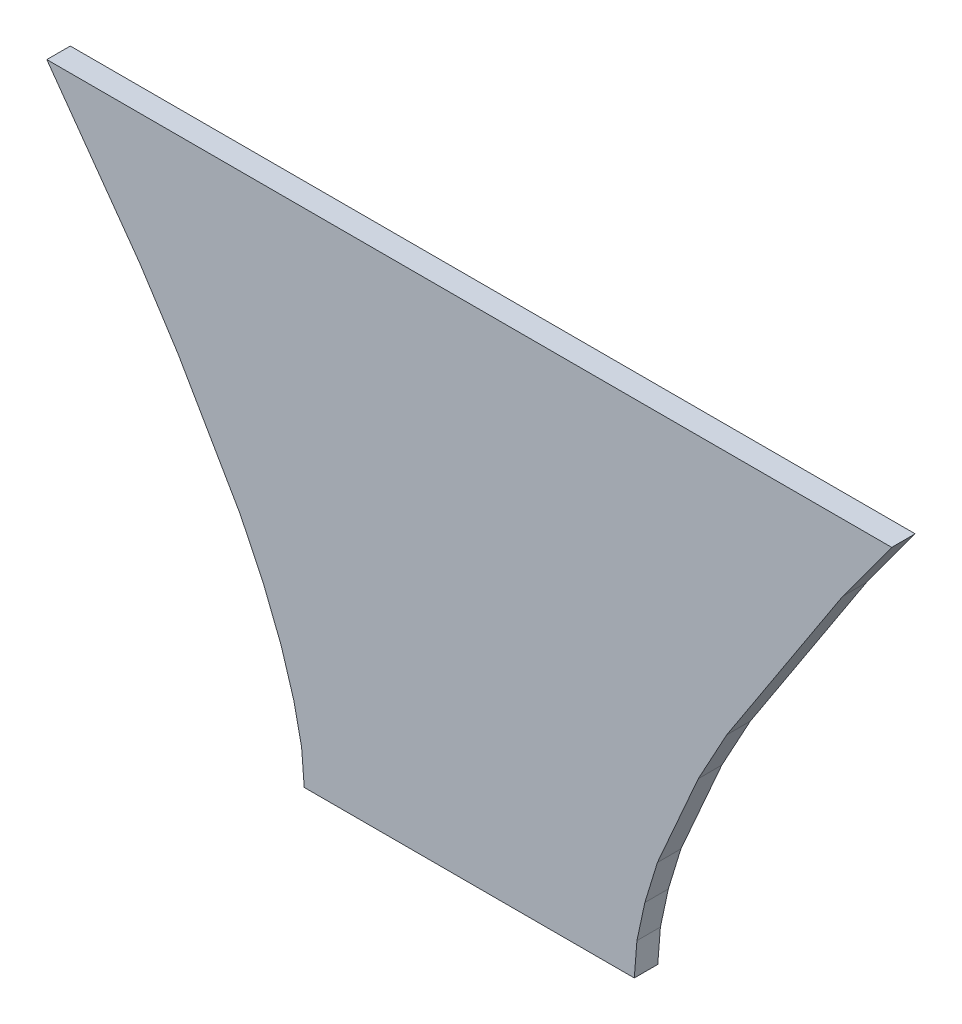
ISO-10303-21;
HEADER;
FILE_DESCRIPTION(('STEP AP214'),'2;1');
FILE_NAME('part.step','',(''),(''),'','','');
FILE_SCHEMA(('AUTOMOTIVE_DESIGN { 1 0 10303 214 1 1 1 1 }'));
ENDSEC;
DATA;
#1=APPLICATION_CONTEXT('core data for automotive mechanical design processes');
#2=APPLICATION_PROTOCOL_DEFINITION('international standard','automotive_design',2000,#1);
#3=PRODUCT_CONTEXT('',#1,'mechanical');
#4=PRODUCT('Part','Part','',(#3));
#5=PRODUCT_RELATED_PRODUCT_CATEGORY('part','',(#4));
#6=PRODUCT_DEFINITION_FORMATION('','',#4);
#7=PRODUCT_DEFINITION_CONTEXT('part definition',#1,'design');
#8=PRODUCT_DEFINITION('design','',#6,#7);
#9=PRODUCT_DEFINITION_SHAPE('','',#8);
#10=(LENGTH_UNIT() NAMED_UNIT(*) SI_UNIT(.MILLI.,.METRE.));
#11=(NAMED_UNIT(*) PLANE_ANGLE_UNIT() SI_UNIT($,.RADIAN.));
#12=(NAMED_UNIT(*) SI_UNIT($,.STERADIAN.) SOLID_ANGLE_UNIT());
#13=UNCERTAINTY_MEASURE_WITH_UNIT(LENGTH_MEASURE(1.E-05),#10,'distance_accuracy_value','');
#14=(GEOMETRIC_REPRESENTATION_CONTEXT(3) GLOBAL_UNCERTAINTY_ASSIGNED_CONTEXT((#13)) GLOBAL_UNIT_ASSIGNED_CONTEXT((#10,
#11,#12)) REPRESENTATION_CONTEXT('',''));
#15=CARTESIAN_POINT('',(0.,0.,0.));
#16=DIRECTION('',(0.,0.,1.));
#17=DIRECTION('',(1.,0.,0.));
#18=AXIS2_PLACEMENT_3D('',#15,#16,#17);
#19=CARTESIAN_POINT('',(115.089996337891,103.059997558594,0.));
#20=DIRECTION('',(-0.996930394738995,0.0782929629376174,0.));
#21=DIRECTION('',(0.0782929629376174,0.996930394738995,0.));
#22=AXIS2_PLACEMENT_3D('',#19,#20,#21);
#23=PLANE('',#22);
#24=DIRECTION('',(0.0782929629376174,0.996930394738995,0.));
#25=VECTOR('',#24,1.);
#26=CARTESIAN_POINT('',(115.089996337891,103.059997558594,0.03556));
#27=LINE('',#26,#25);
#28=CARTESIAN_POINT('',(115.089996337891,103.059997558594,0.03556));
#29=VERTEX_POINT('',#28);
#30=CARTESIAN_POINT('',(115.09400177002,103.111000061035,0.03556));
#31=VERTEX_POINT('',#30);
#32=EDGE_CURVE('E11',#29,#31,#27,.T.);
#33=ORIENTED_EDGE('',*,*,#32,.F.);
#34=DIRECTION('',(0.,0.,1.));
#35=VECTOR('',#34,1.);
#36=CARTESIAN_POINT('',(115.089996337891,103.059997558594,0.));
#37=LINE('',#36,#35);
#38=CARTESIAN_POINT('',(115.089996337891,103.059997558594,0.));
#39=VERTEX_POINT('',#38);
#40=EDGE_CURVE('E24',#39,#29,#37,.T.);
#41=ORIENTED_EDGE('',*,*,#40,.F.);
#42=DIRECTION('',(0.0782929629376174,0.996930394738995,0.));
#43=VECTOR('',#42,1.);
#44=CARTESIAN_POINT('',(115.089996337891,103.059997558594,0.));
#45=LINE('',#44,#43);
#46=CARTESIAN_POINT('',(115.09400177002,103.111000061035,0.));
#47=VERTEX_POINT('',#46);
#48=EDGE_CURVE('E154',#39,#47,#45,.T.);
#49=ORIENTED_EDGE('',*,*,#48,.T.);
#50=DIRECTION('',(0.,0.,1.));
#51=VECTOR('',#50,1.);
#52=CARTESIAN_POINT('',(115.09400177002,103.111000061035,0.));
#53=LINE('',#52,#51);
#54=EDGE_CURVE('E37',#47,#31,#53,.T.);
#55=ORIENTED_EDGE('',*,*,#54,.T.);
#56=EDGE_LOOP('',(#33,#41,#49,#55));
#57=FACE_BOUND('',#56,.T.);
#58=ADVANCED_FACE('F17',(#57),#23,.F.);
#59=CARTESIAN_POINT('',(115.09400177002,103.111000061035,0.));
#60=DIRECTION('',(-0.977798514930854,0.20954728392183,0.));
#61=DIRECTION('',(0.20954728392183,0.977798514930854,0.));
#62=AXIS2_PLACEMENT_3D('',#59,#60,#61);
#63=PLANE('',#62);
#64=DIRECTION('',(0.20954728392183,0.977798514930854,0.));
#65=VECTOR('',#64,1.);
#66=CARTESIAN_POINT('',(115.09400177002,103.111000061035,0.03556));
#67=LINE('',#66,#65);
#68=CARTESIAN_POINT('',(115.106002807617,103.166999816895,0.03556));
#69=VERTEX_POINT('',#68);
#70=EDGE_CURVE('E266',#31,#69,#67,.T.);
#71=ORIENTED_EDGE('',*,*,#70,.F.);
#72=ORIENTED_EDGE('',*,*,#54,.F.);
#73=DIRECTION('',(0.20954728392183,0.977798514930854,0.));
#74=VECTOR('',#73,1.);
#75=CARTESIAN_POINT('',(115.09400177002,103.111000061035,0.));
#76=LINE('',#75,#74);
#77=CARTESIAN_POINT('',(115.106002807617,103.166999816895,0.));
#78=VERTEX_POINT('',#77);
#79=EDGE_CURVE('E263',#47,#78,#76,.T.);
#80=ORIENTED_EDGE('',*,*,#79,.T.);
#81=DIRECTION('',(0.,0.,1.));
#82=VECTOR('',#81,1.);
#83=CARTESIAN_POINT('',(115.106002807617,103.166999816895,0.));
#84=LINE('',#83,#82);
#85=EDGE_CURVE('E261',#78,#69,#84,.T.);
#86=ORIENTED_EDGE('',*,*,#85,.T.);
#87=EDGE_LOOP('',(#71,#72,#80,#86));
#88=FACE_BOUND('',#87,.T.);
#89=ADVANCED_FACE('F274',(#88),#63,.F.);
#90=CARTESIAN_POINT('',(115.106002807617,103.166999816895,0.));
#91=DIRECTION('',(-0.956119267602671,0.292977722905569,0.));
#92=DIRECTION('',(0.292977722905569,0.956119267602671,0.));
#93=AXIS2_PLACEMENT_3D('',#90,#91,#92);
#94=PLANE('',#93);
#95=DIRECTION('',(0.292977722905569,0.956119267602671,0.));
#96=VECTOR('',#95,1.);
#97=CARTESIAN_POINT('',(115.106002807617,103.166999816895,0.03556));
#98=LINE('',#97,#96);
#99=CARTESIAN_POINT('',(115.125,103.228996276855,0.03556));
#100=VERTEX_POINT('',#99);
#101=EDGE_CURVE('E258',#69,#100,#98,.T.);
#102=ORIENTED_EDGE('',*,*,#101,.F.);
#103=ORIENTED_EDGE('',*,*,#85,.F.);
#104=DIRECTION('',(0.292977722905569,0.956119267602671,0.));
#105=VECTOR('',#104,1.);
#106=CARTESIAN_POINT('',(115.106002807617,103.166999816895,0.));
#107=LINE('',#106,#105);
#108=CARTESIAN_POINT('',(115.125,103.228996276855,0.));
#109=VERTEX_POINT('',#108);
#110=EDGE_CURVE('E255',#78,#109,#107,.T.);
#111=ORIENTED_EDGE('',*,*,#110,.T.);
#112=DIRECTION('',(0.,0.,1.));
#113=VECTOR('',#112,1.);
#114=CARTESIAN_POINT('',(115.125,103.228996276855,0.));
#115=LINE('',#114,#113);
#116=EDGE_CURVE('E253',#109,#100,#115,.T.);
#117=ORIENTED_EDGE('',*,*,#116,.T.);
#118=EDGE_LOOP('',(#102,#103,#111,#117));
#119=FACE_BOUND('',#118,.T.);
#120=ADVANCED_FACE('F280',(#119),#94,.F.);
#121=CARTESIAN_POINT('',(115.125,103.228996276855,0.));
#122=DIRECTION('',(-0.91542601011041,0.402486297919986,0.));
#123=DIRECTION('',(0.402486297919986,0.91542601011041,0.));
#124=AXIS2_PLACEMENT_3D('',#121,#122,#123);
#125=PLANE('',#124);
#126=DIRECTION('',(0.402486297919986,0.91542601011041,0.));
#127=VECTOR('',#126,1.);
#128=CARTESIAN_POINT('',(115.125,103.228996276855,0.03556));
#129=LINE('',#128,#127);
#130=CARTESIAN_POINT('',(115.186996459961,103.370002746582,0.03556));
#131=VERTEX_POINT('',#130);
#132=EDGE_CURVE('E250',#100,#131,#129,.T.);
#133=ORIENTED_EDGE('',*,*,#132,.F.);
#134=ORIENTED_EDGE('',*,*,#116,.F.);
#135=DIRECTION('',(0.402486297919986,0.91542601011041,0.));
#136=VECTOR('',#135,1.);
#137=CARTESIAN_POINT('',(115.125,103.228996276855,0.));
#138=LINE('',#137,#136);
#139=CARTESIAN_POINT('',(115.186996459961,103.370002746582,0.));
#140=VERTEX_POINT('',#139);
#141=EDGE_CURVE('E247',#109,#140,#138,.T.);
#142=ORIENTED_EDGE('',*,*,#141,.T.);
#143=DIRECTION('',(0.,0.,1.));
#144=VECTOR('',#143,1.);
#145=CARTESIAN_POINT('',(115.186996459961,103.370002746582,0.));
#146=LINE('',#145,#144);
#147=EDGE_CURVE('E245',#140,#131,#146,.T.);
#148=ORIENTED_EDGE('',*,*,#147,.T.);
#149=EDGE_LOOP('',(#133,#134,#142,#148));
#150=FACE_BOUND('',#149,.T.);
#151=ADVANCED_FACE('F282',(#150),#125,.F.);
#152=CARTESIAN_POINT('',(115.186996459961,103.370002746582,0.));
#153=DIRECTION('',(-0.878274577246839,0.478156634338462,0.));
#154=DIRECTION('',(0.478156634338462,0.878274577246839,0.));
#155=AXIS2_PLACEMENT_3D('',#152,#153,#154);
#156=PLANE('',#155);
#157=DIRECTION('',(0.478156634338462,0.878274577246839,0.));
#158=VECTOR('',#157,1.);
#159=CARTESIAN_POINT('',(115.186996459961,103.370002746582,0.03556));
#160=LINE('',#159,#158);
#161=CARTESIAN_POINT('',(115.230003356934,103.448997497559,0.03556));
#162=VERTEX_POINT('',#161);
#163=EDGE_CURVE('E242',#131,#162,#160,.T.);
#164=ORIENTED_EDGE('',*,*,#163,.F.);
#165=ORIENTED_EDGE('',*,*,#147,.F.);
#166=DIRECTION('',(0.478156634338462,0.878274577246839,0.));
#167=VECTOR('',#166,1.);
#168=CARTESIAN_POINT('',(115.186996459961,103.370002746582,0.));
#169=LINE('',#168,#167);
#170=CARTESIAN_POINT('',(115.230003356934,103.448997497559,0.));
#171=VERTEX_POINT('',#170);
#172=EDGE_CURVE('E239',#140,#171,#169,.T.);
#173=ORIENTED_EDGE('',*,*,#172,.T.);
#174=DIRECTION('',(0.,0.,1.));
#175=VECTOR('',#174,1.);
#176=CARTESIAN_POINT('',(115.230003356934,103.448997497559,0.));
#177=LINE('',#176,#175);
#178=EDGE_CURVE('E237',#171,#162,#177,.T.);
#179=ORIENTED_EDGE('',*,*,#178,.T.);
#180=EDGE_LOOP('',(#164,#165,#173,#179));
#181=FACE_BOUND('',#180,.T.);
#182=ADVANCED_FACE('F287',(#181),#156,.F.);
#183=CARTESIAN_POINT('',(115.230003356934,103.448997497559,0.));
#184=DIRECTION('',(-0.837745255800057,0.5460612478326,0.));
#185=DIRECTION('',(0.5460612478326,0.837745255800057,0.));
#186=AXIS2_PLACEMENT_3D('',#183,#184,#185);
#187=PLANE('',#186);
#188=DIRECTION('',(0.5460612478326,0.837745255800057,0.));
#189=VECTOR('',#188,1.);
#190=CARTESIAN_POINT('',(115.230003356934,103.448997497559,0.03556));
#191=LINE('',#190,#189);
#192=CARTESIAN_POINT('',(115.40599822998,103.71900177002,0.03556));
#193=VERTEX_POINT('',#192);
#194=EDGE_CURVE('E234',#162,#193,#191,.T.);
#195=ORIENTED_EDGE('',*,*,#194,.F.);
#196=ORIENTED_EDGE('',*,*,#178,.F.);
#197=DIRECTION('',(0.5460612478326,0.837745255800057,0.));
#198=VECTOR('',#197,1.);
#199=CARTESIAN_POINT('',(115.230003356934,103.448997497559,0.));
#200=LINE('',#199,#198);
#201=CARTESIAN_POINT('',(115.40599822998,103.71900177002,0.));
#202=VERTEX_POINT('',#201);
#203=EDGE_CURVE('E231',#171,#202,#200,.T.);
#204=ORIENTED_EDGE('',*,*,#203,.T.);
#205=DIRECTION('',(0.,0.,1.));
#206=VECTOR('',#205,1.);
#207=CARTESIAN_POINT('',(115.40599822998,103.71900177002,0.));
#208=LINE('',#207,#206);
#209=EDGE_CURVE('E229',#202,#193,#208,.T.);
#210=ORIENTED_EDGE('',*,*,#209,.T.);
#211=EDGE_LOOP('',(#195,#196,#204,#210));
#212=FACE_BOUND('',#211,.T.);
#213=ADVANCED_FACE('F290',(#212),#187,.F.);
#214=CARTESIAN_POINT('',(115.40599822998,103.71900177002,0.));
#215=DIRECTION('',(-0.806633523114171,0.591051909216458,0.));
#216=DIRECTION('',(0.591051909216458,0.806633523114171,0.));
#217=AXIS2_PLACEMENT_3D('',#214,#215,#216);
#218=PLANE('',#217);
#219=DIRECTION('',(0.591051909216458,0.806633523114171,0.));
#220=VECTOR('',#219,1.);
#221=CARTESIAN_POINT('',(115.40599822998,103.71900177002,0.03556));
#222=LINE('',#221,#220);
#223=CARTESIAN_POINT('',(115.480003356934,103.819999694824,0.03556));
#224=VERTEX_POINT('',#223);
#225=EDGE_CURVE('E226',#193,#224,#222,.T.);
#226=ORIENTED_EDGE('',*,*,#225,.F.);
#227=ORIENTED_EDGE('',*,*,#209,.F.);
#228=DIRECTION('',(0.591051909216458,0.806633523114171,0.));
#229=VECTOR('',#228,1.);
#230=CARTESIAN_POINT('',(115.40599822998,103.71900177002,0.));
#231=LINE('',#230,#229);
#232=CARTESIAN_POINT('',(115.480003356934,103.819999694824,0.));
#233=VERTEX_POINT('',#232);
#234=EDGE_CURVE('E223',#202,#233,#231,.T.);
#235=ORIENTED_EDGE('',*,*,#234,.T.);
#236=DIRECTION('',(0.,0.,1.));
#237=VECTOR('',#236,1.);
#238=CARTESIAN_POINT('',(115.480003356934,103.819999694824,0.));
#239=LINE('',#238,#237);
#240=EDGE_CURVE('E221',#233,#224,#239,.T.);
#241=ORIENTED_EDGE('',*,*,#240,.T.);
#242=EDGE_LOOP('',(#226,#227,#235,#241));
#243=FACE_BOUND('',#242,.T.);
#244=ADVANCED_FACE('F295',(#243),#218,.F.);
#245=CARTESIAN_POINT('',(115.480003356934,103.819999694824,0.));
#246=DIRECTION('',(0.,-1.,0.));
#247=DIRECTION('',(-1.,0.,0.));
#248=AXIS2_PLACEMENT_3D('',#245,#246,#247);
#249=PLANE('',#248);
#250=DIRECTION('',(-1.,0.,0.));
#251=VECTOR('',#250,1.);
#252=CARTESIAN_POINT('',(115.480003356934,103.819999694824,0.03556));
#253=LINE('',#252,#251);
#254=CARTESIAN_POINT('',(114.199996948242,103.819999694824,0.03556));
#255=VERTEX_POINT('',#254);
#256=EDGE_CURVE('E218',#224,#255,#253,.T.);
#257=ORIENTED_EDGE('',*,*,#256,.F.);
#258=ORIENTED_EDGE('',*,*,#240,.F.);
#259=DIRECTION('',(-1.,0.,0.));
#260=VECTOR('',#259,1.);
#261=CARTESIAN_POINT('',(115.480003356934,103.819999694824,0.));
#262=LINE('',#261,#260);
#263=CARTESIAN_POINT('',(114.199996948242,103.819999694824,0.));
#264=VERTEX_POINT('',#263);
#265=EDGE_CURVE('E215',#233,#264,#262,.T.);
#266=ORIENTED_EDGE('',*,*,#265,.T.);
#267=DIRECTION('',(0.,0.,1.));
#268=VECTOR('',#267,1.);
#269=CARTESIAN_POINT('',(114.199996948242,103.819999694824,0.));
#270=LINE('',#269,#268);
#271=EDGE_CURVE('E213',#264,#255,#270,.T.);
#272=ORIENTED_EDGE('',*,*,#271,.T.);
#273=EDGE_LOOP('',(#257,#258,#266,#272));
#274=FACE_BOUND('',#273,.T.);
#275=ADVANCED_FACE('F298',(#274),#249,.F.);
#276=CARTESIAN_POINT('',(114.199996948242,103.819999694824,0.));
#277=DIRECTION('',(0.813160684202326,0.582039261276767,0.));
#278=DIRECTION('',(0.582039261276767,-0.813160684202326,0.));
#279=AXIS2_PLACEMENT_3D('',#276,#277,#278);
#280=PLANE('',#279);
#281=DIRECTION('',(0.582039261276767,-0.813160684202326,0.));
#282=VECTOR('',#281,1.);
#283=CARTESIAN_POINT('',(114.199996948242,103.819999694824,0.03556));
#284=LINE('',#283,#282);
#285=CARTESIAN_POINT('',(114.341003417969,103.623001098633,0.03556));
#286=VERTEX_POINT('',#285);
#287=EDGE_CURVE('E210',#255,#286,#284,.T.);
#288=ORIENTED_EDGE('',*,*,#287,.F.);
#289=ORIENTED_EDGE('',*,*,#271,.F.);
#290=DIRECTION('',(0.582039261276767,-0.813160684202326,0.));
#291=VECTOR('',#290,1.);
#292=CARTESIAN_POINT('',(114.199996948242,103.819999694824,0.));
#293=LINE('',#292,#291);
#294=CARTESIAN_POINT('',(114.341003417969,103.623001098633,0.));
#295=VERTEX_POINT('',#294);
#296=EDGE_CURVE('E207',#264,#295,#293,.T.);
#297=ORIENTED_EDGE('',*,*,#296,.T.);
#298=DIRECTION('',(0.,0.,1.));
#299=VECTOR('',#298,1.);
#300=CARTESIAN_POINT('',(114.341003417969,103.623001098633,0.));
#301=LINE('',#300,#299);
#302=EDGE_CURVE('E205',#295,#286,#301,.T.);
#303=ORIENTED_EDGE('',*,*,#302,.T.);
#304=EDGE_LOOP('',(#288,#289,#297,#303));
#305=FACE_BOUND('',#304,.T.);
#306=ADVANCED_FACE('F303',(#305),#280,.F.);
#307=CARTESIAN_POINT('',(114.341003417969,103.623001098633,0.));
#308=DIRECTION('',(0.84058761762172,0.541675601352913,0.));
#309=DIRECTION('',(0.541675601352913,-0.84058761762172,0.));
#310=AXIS2_PLACEMENT_3D('',#307,#308,#309);
#311=PLANE('',#310);
#312=DIRECTION('',(0.541675601352913,-0.84058761762172,0.));
#313=VECTOR('',#312,1.);
#314=CARTESIAN_POINT('',(114.341003417969,103.623001098633,0.03556));
#315=LINE('',#314,#313);
#316=CARTESIAN_POINT('',(114.399002075195,103.532997131348,0.03556));
#317=VERTEX_POINT('',#316);
#318=EDGE_CURVE('E202',#286,#317,#315,.T.);
#319=ORIENTED_EDGE('',*,*,#318,.F.);
#320=ORIENTED_EDGE('',*,*,#302,.F.);
#321=DIRECTION('',(0.541675601352913,-0.84058761762172,0.));
#322=VECTOR('',#321,1.);
#323=CARTESIAN_POINT('',(114.341003417969,103.623001098633,0.));
#324=LINE('',#323,#322);
#325=CARTESIAN_POINT('',(114.399002075195,103.532997131348,0.));
#326=VERTEX_POINT('',#325);
#327=EDGE_CURVE('E199',#295,#326,#324,.T.);
#328=ORIENTED_EDGE('',*,*,#327,.T.);
#329=DIRECTION('',(0.,0.,1.));
#330=VECTOR('',#329,1.);
#331=CARTESIAN_POINT('',(114.399002075195,103.532997131348,0.));
#332=LINE('',#331,#330);
#333=EDGE_CURVE('E197',#326,#317,#332,.T.);
#334=ORIENTED_EDGE('',*,*,#333,.T.);
#335=EDGE_LOOP('',(#319,#320,#328,#334));
#336=FACE_BOUND('',#335,.T.);
#337=ADVANCED_FACE('F306',(#336),#311,.F.);
#338=CARTESIAN_POINT('',(114.399002075195,103.532997131348,0.));
#339=DIRECTION('',(0.866280078925766,0.499558630048935,0.));
#340=DIRECTION('',(0.499558630048935,-0.866280078925766,0.));
#341=AXIS2_PLACEMENT_3D('',#338,#339,#340);
#342=PLANE('',#341);
#343=DIRECTION('',(0.499558630048935,-0.866280078925766,0.));
#344=VECTOR('',#343,1.);
#345=CARTESIAN_POINT('',(114.399002075195,103.532997131348,0.03556));
#346=LINE('',#345,#344);
#347=CARTESIAN_POINT('',(114.49299621582,103.370002746582,0.03556));
#348=VERTEX_POINT('',#347);
#349=EDGE_CURVE('E194',#317,#348,#346,.T.);
#350=ORIENTED_EDGE('',*,*,#349,.F.);
#351=ORIENTED_EDGE('',*,*,#333,.F.);
#352=DIRECTION('',(0.499558630048935,-0.866280078925766,0.));
#353=VECTOR('',#352,1.);
#354=CARTESIAN_POINT('',(114.399002075195,103.532997131348,0.));
#355=LINE('',#354,#353);
#356=CARTESIAN_POINT('',(114.49299621582,103.370002746582,0.));
#357=VERTEX_POINT('',#356);
#358=EDGE_CURVE('E191',#326,#357,#355,.T.);
#359=ORIENTED_EDGE('',*,*,#358,.T.);
#360=DIRECTION('',(0.,0.,1.));
#361=VECTOR('',#360,1.);
#362=CARTESIAN_POINT('',(114.49299621582,103.370002746582,0.));
#363=LINE('',#362,#361);
#364=EDGE_CURVE('E189',#357,#348,#363,.T.);
#365=ORIENTED_EDGE('',*,*,#364,.T.);
#366=EDGE_LOOP('',(#350,#351,#359,#365));
#367=FACE_BOUND('',#366,.T.);
#368=ADVANCED_FACE('F311',(#367),#342,.F.);
#369=CARTESIAN_POINT('',(114.49299621582,103.370002746582,0.));
#370=DIRECTION('',(0.901711192194647,0.432338901639569,0.));
#371=DIRECTION('',(0.432338901639569,-0.901711192194647,0.));
#372=AXIS2_PLACEMENT_3D('',#369,#370,#371);
#373=PLANE('',#372);
#374=DIRECTION('',(0.432338901639569,-0.901711192194647,0.));
#375=VECTOR('',#374,1.);
#376=CARTESIAN_POINT('',(114.49299621582,103.370002746582,0.03556));
#377=LINE('',#376,#375);
#378=CARTESIAN_POINT('',(114.52799987793,103.296997070313,0.03556));
#379=VERTEX_POINT('',#378);
#380=EDGE_CURVE('E186',#348,#379,#377,.T.);
#381=ORIENTED_EDGE('',*,*,#380,.F.);
#382=ORIENTED_EDGE('',*,*,#364,.F.);
#383=DIRECTION('',(0.432338901639569,-0.901711192194647,0.));
#384=VECTOR('',#383,1.);
#385=CARTESIAN_POINT('',(114.49299621582,103.370002746582,0.));
#386=LINE('',#385,#384);
#387=CARTESIAN_POINT('',(114.52799987793,103.296997070313,0.));
#388=VERTEX_POINT('',#387);
#389=EDGE_CURVE('E183',#357,#388,#386,.T.);
#390=ORIENTED_EDGE('',*,*,#389,.T.);
#391=DIRECTION('',(0.,0.,1.));
#392=VECTOR('',#391,1.);
#393=CARTESIAN_POINT('',(114.52799987793,103.296997070313,0.));
#394=LINE('',#393,#392);
#395=EDGE_CURVE('E181',#388,#379,#394,.T.);
#396=ORIENTED_EDGE('',*,*,#395,.T.);
#397=EDGE_LOOP('',(#381,#382,#390,#396));
#398=FACE_BOUND('',#397,.T.);
#399=ADVANCED_FACE('F314',(#398),#373,.F.);
#400=CARTESIAN_POINT('',(114.52799987793,103.296997070313,0.));
#401=DIRECTION('',(0.929415787299834,0.369034272551791,0.));
#402=DIRECTION('',(0.369034272551791,-0.929415787299834,0.));
#403=AXIS2_PLACEMENT_3D('',#400,#401,#402);
#404=PLANE('',#403);
#405=DIRECTION('',(0.369034272551791,-0.929415787299834,0.));
#406=VECTOR('',#405,1.);
#407=CARTESIAN_POINT('',(114.52799987793,103.296997070313,0.03556));
#408=LINE('',#407,#406);
#409=CARTESIAN_POINT('',(114.555000305176,103.228996276855,0.03556));
#410=VERTEX_POINT('',#409);
#411=EDGE_CURVE('E178',#379,#410,#408,.T.);
#412=ORIENTED_EDGE('',*,*,#411,.F.);
#413=ORIENTED_EDGE('',*,*,#395,.F.);
#414=DIRECTION('',(0.369034272551791,-0.929415787299834,0.));
#415=VECTOR('',#414,1.);
#416=CARTESIAN_POINT('',(114.52799987793,103.296997070313,0.));
#417=LINE('',#416,#415);
#418=CARTESIAN_POINT('',(114.555000305176,103.228996276855,0.));
#419=VERTEX_POINT('',#418);
#420=EDGE_CURVE('E175',#388,#419,#417,.T.);
#421=ORIENTED_EDGE('',*,*,#420,.T.);
#422=DIRECTION('',(0.,0.,1.));
#423=VECTOR('',#422,1.);
#424=CARTESIAN_POINT('',(114.555000305176,103.228996276855,0.));
#425=LINE('',#424,#423);
#426=EDGE_CURVE('E173',#419,#410,#425,.T.);
#427=ORIENTED_EDGE('',*,*,#426,.T.);
#428=EDGE_LOOP('',(#412,#413,#421,#427));
#429=FACE_BOUND('',#428,.T.);
#430=ADVANCED_FACE('F319',(#429),#404,.F.);
#431=CARTESIAN_POINT('',(114.555000305176,103.228996276855,0.));
#432=DIRECTION('',(0.956119267602671,0.292977722905569,0.));
#433=DIRECTION('',(0.292977722905569,-0.956119267602671,0.));
#434=AXIS2_PLACEMENT_3D('',#431,#432,#433);
#435=PLANE('',#434);
#436=DIRECTION('',(0.292977722905569,-0.956119267602671,0.));
#437=VECTOR('',#436,1.);
#438=CARTESIAN_POINT('',(114.555000305176,103.228996276855,0.03556));
#439=LINE('',#438,#437);
#440=CARTESIAN_POINT('',(114.573997497559,103.166999816895,0.03556));
#441=VERTEX_POINT('',#440);
#442=EDGE_CURVE('E170',#410,#441,#439,.T.);
#443=ORIENTED_EDGE('',*,*,#442,.F.);
#444=ORIENTED_EDGE('',*,*,#426,.F.);
#445=DIRECTION('',(0.292977722905569,-0.956119267602671,0.));
#446=VECTOR('',#445,1.);
#447=CARTESIAN_POINT('',(114.555000305176,103.228996276855,0.));
#448=LINE('',#447,#446);
#449=CARTESIAN_POINT('',(114.573997497559,103.166999816895,0.));
#450=VERTEX_POINT('',#449);
#451=EDGE_CURVE('E167',#419,#450,#448,.T.);
#452=ORIENTED_EDGE('',*,*,#451,.T.);
#453=DIRECTION('',(0.,0.,1.));
#454=VECTOR('',#453,1.);
#455=CARTESIAN_POINT('',(114.573997497559,103.166999816895,0.));
#456=LINE('',#455,#454);
#457=EDGE_CURVE('E165',#450,#441,#456,.T.);
#458=ORIENTED_EDGE('',*,*,#457,.T.);
#459=EDGE_LOOP('',(#443,#444,#452,#458));
#460=FACE_BOUND('',#459,.T.);
#461=ADVANCED_FACE('F322',(#460),#435,.F.);
#462=CARTESIAN_POINT('',(114.573997497559,103.166999816895,0.));
#463=DIRECTION('',(0.977798514930854,0.20954728392183,0.));
#464=DIRECTION('',(0.20954728392183,-0.977798514930854,0.));
#465=AXIS2_PLACEMENT_3D('',#462,#463,#464);
#466=PLANE('',#465);
#467=DIRECTION('',(0.20954728392183,-0.977798514930854,0.));
#468=VECTOR('',#467,1.);
#469=CARTESIAN_POINT('',(114.573997497559,103.166999816895,0.03556));
#470=LINE('',#469,#468);
#471=CARTESIAN_POINT('',(114.585998535156,103.111000061035,0.03556));
#472=VERTEX_POINT('',#471);
#473=EDGE_CURVE('E162',#441,#472,#470,.T.);
#474=ORIENTED_EDGE('',*,*,#473,.F.);
#475=ORIENTED_EDGE('',*,*,#457,.F.);
#476=DIRECTION('',(0.20954728392183,-0.977798514930854,0.));
#477=VECTOR('',#476,1.);
#478=CARTESIAN_POINT('',(114.573997497559,103.166999816895,0.));
#479=LINE('',#478,#477);
#480=CARTESIAN_POINT('',(114.585998535156,103.111000061035,0.));
#481=VERTEX_POINT('',#480);
#482=EDGE_CURVE('E160',#450,#481,#479,.T.);
#483=ORIENTED_EDGE('',*,*,#482,.T.);
#484=DIRECTION('',(0.,0.,1.));
#485=VECTOR('',#484,1.);
#486=CARTESIAN_POINT('',(114.585998535156,103.111000061035,0.));
#487=LINE('',#486,#485);
#488=EDGE_CURVE('E145',#481,#472,#487,.T.);
#489=ORIENTED_EDGE('',*,*,#488,.T.);
#490=EDGE_LOOP('',(#474,#475,#483,#489));
#491=FACE_BOUND('',#490,.T.);
#492=ADVANCED_FACE('F325',(#491),#466,.F.);
#493=CARTESIAN_POINT('',(114.585998535156,103.111000061035,0.));
#494=DIRECTION('',(0.996942023803503,0.0781447450221444,0.));
#495=DIRECTION('',(0.0781447450221444,-0.996942023803503,0.));
#496=AXIS2_PLACEMENT_3D('',#493,#494,#495);
#497=PLANE('',#496);
#498=DIRECTION('',(0.0781447450221444,-0.996942023803503,0.));
#499=VECTOR('',#498,1.);
#500=CARTESIAN_POINT('',(114.585998535156,103.111000061035,0.03556));
#501=LINE('',#500,#499);
#502=CARTESIAN_POINT('',(114.589996337891,103.059997558594,0.03556));
#503=VERTEX_POINT('',#502);
#504=EDGE_CURVE('E149',#472,#503,#501,.T.);
#505=ORIENTED_EDGE('',*,*,#504,.F.);
#506=ORIENTED_EDGE('',*,*,#488,.F.);
#507=DIRECTION('',(0.0781447450221444,-0.996942023803503,0.));
#508=VECTOR('',#507,1.);
#509=CARTESIAN_POINT('',(114.585998535156,103.111000061035,0.));
#510=LINE('',#509,#508);
#511=CARTESIAN_POINT('',(114.589996337891,103.059997558594,0.));
#512=VERTEX_POINT('',#511);
#513=EDGE_CURVE('E141',#481,#512,#510,.T.);
#514=ORIENTED_EDGE('',*,*,#513,.T.);
#515=DIRECTION('',(0.,0.,1.));
#516=VECTOR('',#515,1.);
#517=CARTESIAN_POINT('',(114.589996337891,103.059997558594,0.));
#518=LINE('',#517,#516);
#519=EDGE_CURVE('E131',#512,#503,#518,.T.);
#520=ORIENTED_EDGE('',*,*,#519,.T.);
#521=EDGE_LOOP('',(#505,#506,#514,#520));
#522=FACE_BOUND('',#521,.T.);
#523=ADVANCED_FACE('F144',(#522),#497,.F.);
#524=CARTESIAN_POINT('',(114.589996337891,103.059997558594,0.));
#525=DIRECTION('',(0.,1.,0.));
#526=DIRECTION('',(1.,0.,0.));
#527=AXIS2_PLACEMENT_3D('',#524,#525,#526);
#528=PLANE('',#527);
#529=DIRECTION('',(1.,0.,0.));
#530=VECTOR('',#529,1.);
#531=CARTESIAN_POINT('',(114.589996337891,103.059997558594,0.03556));
#532=LINE('',#531,#530);
#533=EDGE_CURVE('E137',#503,#29,#532,.T.);
#534=ORIENTED_EDGE('',*,*,#533,.F.);
#535=ORIENTED_EDGE('',*,*,#519,.F.);
#536=DIRECTION('',(1.,0.,0.));
#537=VECTOR('',#536,1.);
#538=CARTESIAN_POINT('',(114.589996337891,103.059997558594,0.));
#539=LINE('',#538,#537);
#540=EDGE_CURVE('E135',#512,#39,#539,.T.);
#541=ORIENTED_EDGE('',*,*,#540,.T.);
#542=ORIENTED_EDGE('',*,*,#40,.T.);
#543=EDGE_LOOP('',(#534,#535,#541,#542));
#544=FACE_BOUND('',#543,.T.);
#545=ADVANCED_FACE('F133',(#544),#528,.F.);
#546=CARTESIAN_POINT('',(115.089996337891,103.059997558594,0.));
#547=DIRECTION('',(0.,0.,1.));
#548=DIRECTION('',(1.,0.,0.));
#549=AXIS2_PLACEMENT_3D('',#546,#547,#548);
#550=PLANE('',#549);
#551=ORIENTED_EDGE('',*,*,#540,.F.);
#552=ORIENTED_EDGE('',*,*,#513,.F.);
#553=ORIENTED_EDGE('',*,*,#482,.F.);
#554=ORIENTED_EDGE('',*,*,#451,.F.);
#555=ORIENTED_EDGE('',*,*,#420,.F.);
#556=ORIENTED_EDGE('',*,*,#389,.F.);
#557=ORIENTED_EDGE('',*,*,#358,.F.);
#558=ORIENTED_EDGE('',*,*,#327,.F.);
#559=ORIENTED_EDGE('',*,*,#296,.F.);
#560=ORIENTED_EDGE('',*,*,#265,.F.);
#561=ORIENTED_EDGE('',*,*,#234,.F.);
#562=ORIENTED_EDGE('',*,*,#203,.F.);
#563=ORIENTED_EDGE('',*,*,#172,.F.);
#564=ORIENTED_EDGE('',*,*,#141,.F.);
#565=ORIENTED_EDGE('',*,*,#110,.F.);
#566=ORIENTED_EDGE('',*,*,#79,.F.);
#567=ORIENTED_EDGE('',*,*,#48,.F.);
#568=EDGE_LOOP('',(#551,#552,#553,#554,#555,#556,#557,#558,#559,#560,#561,#562,#563,#564,#565,
#566,#567));
#569=FACE_BOUND('',#568,.T.);
#570=ADVANCED_FACE('F152',(#569),#550,.F.);
#571=CARTESIAN_POINT('',(115.089996337891,103.059997558594,0.03556));
#572=DIRECTION('',(0.,0.,1.));
#573=DIRECTION('',(1.,0.,0.));
#574=AXIS2_PLACEMENT_3D('',#571,#572,#573);
#575=PLANE('',#574);
#576=ORIENTED_EDGE('',*,*,#32,.T.);
#577=ORIENTED_EDGE('',*,*,#70,.T.);
#578=ORIENTED_EDGE('',*,*,#101,.T.);
#579=ORIENTED_EDGE('',*,*,#132,.T.);
#580=ORIENTED_EDGE('',*,*,#163,.T.);
#581=ORIENTED_EDGE('',*,*,#194,.T.);
#582=ORIENTED_EDGE('',*,*,#225,.T.);
#583=ORIENTED_EDGE('',*,*,#256,.T.);
#584=ORIENTED_EDGE('',*,*,#287,.T.);
#585=ORIENTED_EDGE('',*,*,#318,.T.);
#586=ORIENTED_EDGE('',*,*,#349,.T.);
#587=ORIENTED_EDGE('',*,*,#380,.T.);
#588=ORIENTED_EDGE('',*,*,#411,.T.);
#589=ORIENTED_EDGE('',*,*,#442,.T.);
#590=ORIENTED_EDGE('',*,*,#473,.T.);
#591=ORIENTED_EDGE('',*,*,#504,.T.);
#592=ORIENTED_EDGE('',*,*,#533,.T.);
#593=EDGE_LOOP('',(#576,#577,#578,#579,#580,#581,#582,#583,#584,#585,#586,#587,#588,#589,#590,
#591,#592));
#594=FACE_BOUND('',#593,.T.);
#595=ADVANCED_FACE('F277',(#594),#575,.T.);
#596=CLOSED_SHELL('',(#58,#89,#120,#151,#182,#213,#244,#275,#306,#337,#368,#399,#430,#461,#492,
#523,#545,#570,#595));
#597=MANIFOLD_SOLID_BREP('B1',#596);
#598=ADVANCED_BREP_SHAPE_REPRESENTATION('',(#18,#597),#14);
#599=SHAPE_DEFINITION_REPRESENTATION(#9,#598);
ENDSEC;
END-ISO-10303-21;
